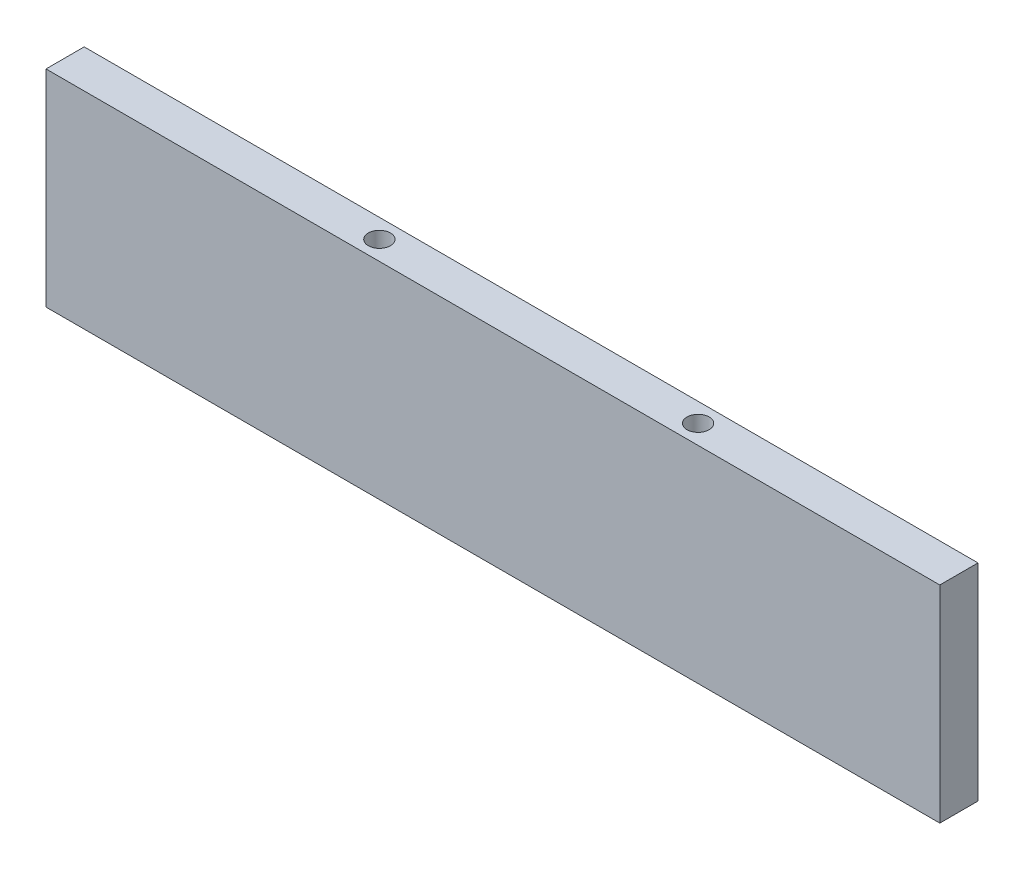
ISO-10303-21;
HEADER;
FILE_DESCRIPTION(('STEP AP214'),'2;1');
FILE_NAME('part.step','',(''),(''),'','','');
FILE_SCHEMA(('AUTOMOTIVE_DESIGN { 1 0 10303 214 1 1 1 1 }'));
ENDSEC;
DATA;
#1=APPLICATION_CONTEXT('core data for automotive mechanical design processes');
#2=APPLICATION_PROTOCOL_DEFINITION('international standard','automotive_design',2000,#1);
#3=PRODUCT_CONTEXT('',#1,'mechanical');
#4=PRODUCT('Part','Part','',(#3));
#5=PRODUCT_RELATED_PRODUCT_CATEGORY('part','',(#4));
#6=PRODUCT_DEFINITION_FORMATION('','',#4);
#7=PRODUCT_DEFINITION_CONTEXT('part definition',#1,'design');
#8=PRODUCT_DEFINITION('design','',#6,#7);
#9=PRODUCT_DEFINITION_SHAPE('','',#8);
#10=(LENGTH_UNIT() NAMED_UNIT(*) SI_UNIT(.MILLI.,.METRE.));
#11=(NAMED_UNIT(*) PLANE_ANGLE_UNIT() SI_UNIT($,.RADIAN.));
#12=(NAMED_UNIT(*) SI_UNIT($,.STERADIAN.) SOLID_ANGLE_UNIT());
#13=UNCERTAINTY_MEASURE_WITH_UNIT(LENGTH_MEASURE(1.E-05),#10,'distance_accuracy_value','');
#14=(GEOMETRIC_REPRESENTATION_CONTEXT(3) GLOBAL_UNCERTAINTY_ASSIGNED_CONTEXT((#13)) GLOBAL_UNIT_ASSIGNED_CONTEXT((#10,
#11,#12)) REPRESENTATION_CONTEXT('',''));
#15=CARTESIAN_POINT('',(0.,0.,0.));
#16=DIRECTION('',(0.,0.,1.));
#17=DIRECTION('',(1.,0.,0.));
#18=AXIS2_PLACEMENT_3D('',#15,#16,#17);
#19=CARTESIAN_POINT('',(-62.,27.,2.50000000000001));
#20=DIRECTION('',(1.,0.,0.));
#21=DIRECTION('',(0.,0.,-1.));
#22=AXIS2_PLACEMENT_3D('',#19,#20,#21);
#23=PLANE('',#22);
#24=DIRECTION('',(0.,0.,1.));
#25=VECTOR('',#24,1.);
#26=CARTESIAN_POINT('',(-62.,0.,2.50000000000001));
#27=LINE('',#26,#25);
#28=CARTESIAN_POINT('',(-62.,0.,-2.49999999999999));
#29=VERTEX_POINT('',#28);
#30=CARTESIAN_POINT('',(-62.,0.,2.50000000000001));
#31=VERTEX_POINT('',#30);
#32=EDGE_CURVE('E107',#29,#31,#27,.T.);
#33=ORIENTED_EDGE('',*,*,#32,.T.);
#34=DIRECTION('',(0.,-1.,0.));
#35=VECTOR('',#34,1.);
#36=CARTESIAN_POINT('',(-62.,27.,2.50000000000001));
#37=LINE('',#36,#35);
#38=CARTESIAN_POINT('',(-62.,27.,2.50000000000001));
#39=VERTEX_POINT('',#38);
#40=EDGE_CURVE('E11',#39,#31,#37,.T.);
#41=ORIENTED_EDGE('',*,*,#40,.F.);
#42=DIRECTION('',(0.,0.,1.));
#43=VECTOR('',#42,1.);
#44=CARTESIAN_POINT('',(-62.,27.,2.50000000000001));
#45=LINE('',#44,#43);
#46=CARTESIAN_POINT('',(-62.,27.,-2.49999999999999));
#47=VERTEX_POINT('',#46);
#48=EDGE_CURVE('E91',#47,#39,#45,.T.);
#49=ORIENTED_EDGE('',*,*,#48,.F.);
#50=DIRECTION('',(0.,-1.,0.));
#51=VECTOR('',#50,1.);
#52=CARTESIAN_POINT('',(-62.,27.,-2.49999999999999));
#53=LINE('',#52,#51);
#54=EDGE_CURVE('E103',#47,#29,#53,.T.);
#55=ORIENTED_EDGE('',*,*,#54,.T.);
#56=EDGE_LOOP('',(#33,#41,#49,#55));
#57=FACE_BOUND('',#56,.T.);
#58=ADVANCED_FACE('F39',(#57),#23,.F.);
#59=CARTESIAN_POINT('',(55.,27.,2.49999999999999));
#60=DIRECTION('',(0.,0.,-1.));
#61=DIRECTION('',(-1.,0.,0.));
#62=AXIS2_PLACEMENT_3D('',#59,#60,#61);
#63=PLANE('',#62);
#64=DIRECTION('',(1.,0.,0.));
#65=VECTOR('',#64,1.);
#66=CARTESIAN_POINT('',(55.,0.,2.49999999999999));
#67=LINE('',#66,#65);
#68=CARTESIAN_POINT('',(55.,0.,2.49999999999999));
#69=VERTEX_POINT('',#68);
#70=EDGE_CURVE('E96',#31,#69,#67,.T.);
#71=ORIENTED_EDGE('',*,*,#70,.T.);
#72=DIRECTION('',(0.,-1.,0.));
#73=VECTOR('',#72,1.);
#74=CARTESIAN_POINT('',(55.,27.,2.49999999999999));
#75=LINE('',#74,#73);
#76=CARTESIAN_POINT('',(55.,27.,2.49999999999999));
#77=VERTEX_POINT('',#76);
#78=EDGE_CURVE('E48',#77,#69,#75,.T.);
#79=ORIENTED_EDGE('',*,*,#78,.F.);
#80=DIRECTION('',(1.,0.,0.));
#81=VECTOR('',#80,1.);
#82=CARTESIAN_POINT('',(55.,27.,2.49999999999999));
#83=LINE('',#82,#81);
#84=EDGE_CURVE('E86',#39,#77,#83,.T.);
#85=ORIENTED_EDGE('',*,*,#84,.F.);
#86=ORIENTED_EDGE('',*,*,#40,.T.);
#87=EDGE_LOOP('',(#71,#79,#85,#86));
#88=FACE_BOUND('',#87,.T.);
#89=ADVANCED_FACE('F95',(#88),#63,.F.);
#90=CARTESIAN_POINT('',(55.,27.,2.49999999999999));
#91=DIRECTION('',(-1.,0.,0.));
#92=DIRECTION('',(0.,0.,1.));
#93=AXIS2_PLACEMENT_3D('',#90,#91,#92);
#94=PLANE('',#93);
#95=DIRECTION('',(0.,0.,-1.));
#96=VECTOR('',#95,1.);
#97=CARTESIAN_POINT('',(55.,0.,2.49999999999999));
#98=LINE('',#97,#96);
#99=CARTESIAN_POINT('',(55.,0.,-2.50000000000001));
#100=VERTEX_POINT('',#99);
#101=EDGE_CURVE('E73',#69,#100,#98,.T.);
#102=ORIENTED_EDGE('',*,*,#101,.T.);
#103=DIRECTION('',(0.,-1.,0.));
#104=VECTOR('',#103,1.);
#105=CARTESIAN_POINT('',(55.,27.,-2.50000000000001));
#106=LINE('',#105,#104);
#107=CARTESIAN_POINT('',(55.,27.,-2.50000000000001));
#108=VERTEX_POINT('',#107);
#109=EDGE_CURVE('E98',#108,#100,#106,.T.);
#110=ORIENTED_EDGE('',*,*,#109,.F.);
#111=DIRECTION('',(0.,0.,-1.));
#112=VECTOR('',#111,1.);
#113=CARTESIAN_POINT('',(55.,27.,2.49999999999999));
#114=LINE('',#113,#112);
#115=EDGE_CURVE('E89',#77,#108,#114,.T.);
#116=ORIENTED_EDGE('',*,*,#115,.F.);
#117=ORIENTED_EDGE('',*,*,#78,.T.);
#118=EDGE_LOOP('',(#102,#110,#116,#117));
#119=FACE_BOUND('',#118,.T.);
#120=ADVANCED_FACE('F99',(#119),#94,.F.);
#121=CARTESIAN_POINT('',(55.,27.,-2.50000000000001));
#122=DIRECTION('',(0.,0.,1.));
#123=DIRECTION('',(1.,0.,0.));
#124=AXIS2_PLACEMENT_3D('',#121,#122,#123);
#125=PLANE('',#124);
#126=DIRECTION('',(-1.,0.,0.));
#127=VECTOR('',#126,1.);
#128=CARTESIAN_POINT('',(55.,0.,-2.50000000000001));
#129=LINE('',#128,#127);
#130=EDGE_CURVE('E79',#100,#29,#129,.T.);
#131=ORIENTED_EDGE('',*,*,#130,.T.);
#132=ORIENTED_EDGE('',*,*,#54,.F.);
#133=DIRECTION('',(-1.,0.,0.));
#134=VECTOR('',#133,1.);
#135=CARTESIAN_POINT('',(55.,27.,-2.50000000000001));
#136=LINE('',#135,#134);
#137=EDGE_CURVE('E56',#108,#47,#136,.T.);
#138=ORIENTED_EDGE('',*,*,#137,.F.);
#139=ORIENTED_EDGE('',*,*,#109,.T.);
#140=EDGE_LOOP('',(#131,#132,#138,#139));
#141=FACE_BOUND('',#140,.T.);
#142=ADVANCED_FACE('F121',(#141),#125,.F.);
#143=CARTESIAN_POINT('',(0.,27.,0.));
#144=DIRECTION('',(0.,1.,0.));
#145=DIRECTION('',(0.,0.,1.));
#146=AXIS2_PLACEMENT_3D('',#143,#144,#145);
#147=PLANE('',#146);
#148=CARTESIAN_POINT('',(-20.86,27.,0.));
#149=DIRECTION('',(0.,1.,0.));
#150=DIRECTION('',(0.,0.,1.));
#151=AXIS2_PLACEMENT_3D('',#148,#149,#150);
#152=CIRCLE('',#151,1.45);
#153=CARTESIAN_POINT('',(-20.86,27.,1.45));
#154=VERTEX_POINT('',#153);
#155=EDGE_CURVE('E111',#154,#154,#152,.F.);
#156=ORIENTED_EDGE('',*,*,#155,.T.);
#157=EDGE_LOOP('',(#156));
#158=FACE_BOUND('',#157,.T.);
#159=CARTESIAN_POINT('',(20.86,27.,0.));
#160=DIRECTION('',(0.,1.,0.));
#161=DIRECTION('',(0.,0.,1.));
#162=AXIS2_PLACEMENT_3D('',#159,#160,#161);
#163=CIRCLE('',#162,1.45);
#164=CARTESIAN_POINT('',(20.86,27.,1.45));
#165=VERTEX_POINT('',#164);
#166=EDGE_CURVE('E131',#165,#165,#163,.F.);
#167=ORIENTED_EDGE('',*,*,#166,.T.);
#168=EDGE_LOOP('',(#167));
#169=FACE_BOUND('',#168,.T.);
#170=ORIENTED_EDGE('',*,*,#48,.T.);
#171=ORIENTED_EDGE('',*,*,#84,.T.);
#172=ORIENTED_EDGE('',*,*,#115,.T.);
#173=ORIENTED_EDGE('',*,*,#137,.T.);
#174=EDGE_LOOP('',(#170,#171,#172,#173));
#175=FACE_BOUND('',#174,.T.);
#176=ADVANCED_FACE('F87',(#158,#169,#175),#147,.T.);
#177=CARTESIAN_POINT('',(0.,0.,0.));
#178=DIRECTION('',(0.,1.,0.));
#179=DIRECTION('',(0.,0.,1.));
#180=AXIS2_PLACEMENT_3D('',#177,#178,#179);
#181=PLANE('',#180);
#182=CARTESIAN_POINT('',(-20.86,0.,0.));
#183=DIRECTION('',(0.,1.,0.));
#184=DIRECTION('',(0.,0.,1.));
#185=AXIS2_PLACEMENT_3D('',#182,#183,#184);
#186=CIRCLE('',#185,1.45);
#187=CARTESIAN_POINT('',(-20.86,0.,1.45));
#188=VERTEX_POINT('',#187);
#189=EDGE_CURVE('E135',#188,#188,#186,.T.);
#190=ORIENTED_EDGE('',*,*,#189,.T.);
#191=EDGE_LOOP('',(#190));
#192=FACE_BOUND('',#191,.T.);
#193=CARTESIAN_POINT('',(20.86,0.,0.));
#194=DIRECTION('',(0.,1.,0.));
#195=DIRECTION('',(0.,0.,-1.));
#196=AXIS2_PLACEMENT_3D('',#193,#194,#195);
#197=CIRCLE('',#196,1.45);
#198=CARTESIAN_POINT('',(20.86,0.,-1.45));
#199=VERTEX_POINT('',#198);
#200=EDGE_CURVE('E136',#199,#199,#197,.T.);
#201=ORIENTED_EDGE('',*,*,#200,.T.);
#202=EDGE_LOOP('',(#201));
#203=FACE_BOUND('',#202,.T.);
#204=ORIENTED_EDGE('',*,*,#32,.F.);
#205=ORIENTED_EDGE('',*,*,#130,.F.);
#206=ORIENTED_EDGE('',*,*,#101,.F.);
#207=ORIENTED_EDGE('',*,*,#70,.F.);
#208=EDGE_LOOP('',(#204,#205,#206,#207));
#209=FACE_BOUND('',#208,.T.);
#210=ADVANCED_FACE('F124',(#192,#203,#209),#181,.F.);
#211=CARTESIAN_POINT('',(20.86,30.,0.));
#212=DIRECTION('',(0.,-1.,0.));
#213=DIRECTION('',(0.,0.,-1.));
#214=AXIS2_PLACEMENT_3D('',#211,#212,#213);
#215=CYLINDRICAL_SURFACE('',#214,1.45);
#216=ORIENTED_EDGE('',*,*,#166,.F.);
#217=EDGE_LOOP('',(#216));
#218=FACE_BOUND('',#217,.T.);
#219=ORIENTED_EDGE('',*,*,#200,.F.);
#220=EDGE_LOOP('',(#219));
#221=FACE_BOUND('',#220,.T.);
#222=ADVANCED_FACE('F148',(#218,#221),#215,.F.);
#223=CARTESIAN_POINT('',(-20.86,30.,0.));
#224=DIRECTION('',(0.,-1.,0.));
#225=DIRECTION('',(0.,0.,-1.));
#226=AXIS2_PLACEMENT_3D('',#223,#224,#225);
#227=CYLINDRICAL_SURFACE('',#226,1.45);
#228=ORIENTED_EDGE('',*,*,#155,.F.);
#229=EDGE_LOOP('',(#228));
#230=FACE_BOUND('',#229,.T.);
#231=ORIENTED_EDGE('',*,*,#189,.F.);
#232=EDGE_LOOP('',(#231));
#233=FACE_BOUND('',#232,.T.);
#234=ADVANCED_FACE('F146',(#230,#233),#227,.F.);
#235=CLOSED_SHELL('',(#58,#89,#120,#142,#176,#210,#222,#234));
#236=MANIFOLD_SOLID_BREP('B2',#235);
#237=ADVANCED_BREP_SHAPE_REPRESENTATION('',(#18,#236),#14);
#238=SHAPE_DEFINITION_REPRESENTATION(#9,#237);
ENDSEC;
END-ISO-10303-21;
